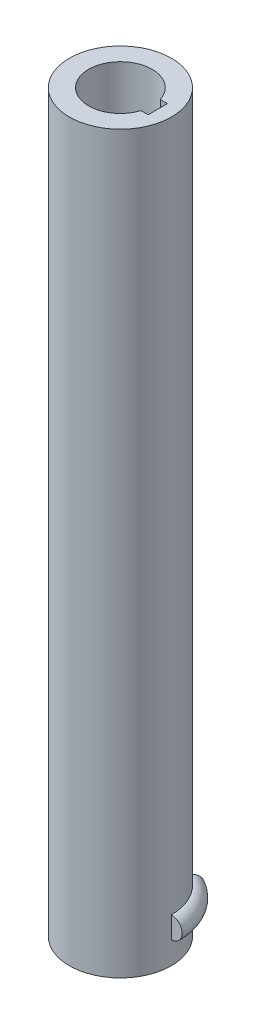
ISO-10303-21;
HEADER;
FILE_DESCRIPTION(('STEP AP214'),'2;1');
FILE_NAME('part.step','',(''),(''),'','','');
FILE_SCHEMA(('AUTOMOTIVE_DESIGN { 1 0 10303 214 1 1 1 1 }'));
ENDSEC;
DATA;
#1=APPLICATION_CONTEXT('core data for automotive mechanical design processes');
#2=APPLICATION_PROTOCOL_DEFINITION('international standard','automotive_design',2000,#1);
#3=PRODUCT_CONTEXT('',#1,'mechanical');
#4=PRODUCT('Part','Part','',(#3));
#5=PRODUCT_RELATED_PRODUCT_CATEGORY('part','',(#4));
#6=PRODUCT_DEFINITION_FORMATION('','',#4);
#7=PRODUCT_DEFINITION_CONTEXT('part definition',#1,'design');
#8=PRODUCT_DEFINITION('design','',#6,#7);
#9=PRODUCT_DEFINITION_SHAPE('','',#8);
#10=(LENGTH_UNIT() NAMED_UNIT(*) SI_UNIT(.MILLI.,.METRE.));
#11=(NAMED_UNIT(*) PLANE_ANGLE_UNIT() SI_UNIT($,.RADIAN.));
#12=(NAMED_UNIT(*) SI_UNIT($,.STERADIAN.) SOLID_ANGLE_UNIT());
#13=UNCERTAINTY_MEASURE_WITH_UNIT(LENGTH_MEASURE(1.E-05),#10,'distance_accuracy_value','');
#14=(GEOMETRIC_REPRESENTATION_CONTEXT(3) GLOBAL_UNCERTAINTY_ASSIGNED_CONTEXT((#13)) GLOBAL_UNIT_ASSIGNED_CONTEXT((#10,
#11,#12)) REPRESENTATION_CONTEXT('',''));
#15=CARTESIAN_POINT('',(0.,0.,0.));
#16=DIRECTION('',(0.,0.,1.));
#17=DIRECTION('',(1.,0.,0.));
#18=AXIS2_PLACEMENT_3D('',#15,#16,#17);
#19=CARTESIAN_POINT('',(-22.5000000000001,619.,-38.9711431702998));
#20=DIRECTION('',(0.,-1.,0.));
#21=DIRECTION('',(0.,0.,-1.));
#22=AXIS2_PLACEMENT_3D('',#19,#20,#21);
#23=PLANE('',#22);
#24=DIRECTION('',(0.,0.,-1.));
#25=VECTOR('',#24,1.);
#26=CARTESIAN_POINT('',(-12.,619.,8.5));
#27=LINE('',#26,#25);
#28=CARTESIAN_POINT('',(-12.,619.,8.5));
#29=VERTEX_POINT('',#28);
#30=CARTESIAN_POINT('',(-12.,619.,-8.5));
#31=VERTEX_POINT('',#30);
#32=EDGE_CURVE('E98',#29,#31,#27,.T.);
#33=ORIENTED_EDGE('',*,*,#32,.F.);
#34=DIRECTION('',(1.,0.,0.));
#35=VECTOR('',#34,1.);
#36=CARTESIAN_POINT('',(-18.3213568560918,619.,8.5));
#37=LINE('',#36,#35);
#38=CARTESIAN_POINT('',(-18.3213568560918,619.,8.5));
#39=VERTEX_POINT('',#38);
#40=EDGE_CURVE('E95',#39,#29,#37,.T.);
#41=ORIENTED_EDGE('',*,*,#40,.F.);
#42=CARTESIAN_POINT('',(-45.,619.,0.));
#43=DIRECTION('',(0.,1.,0.));
#44=DIRECTION('',(0.,0.,1.));
#45=AXIS2_PLACEMENT_3D('',#42,#43,#44);
#46=CIRCLE('',#45,28.);
#47=CARTESIAN_POINT('',(-18.3213568560918,619.,-8.5));
#48=VERTEX_POINT('',#47);
#49=EDGE_CURVE('E109',#48,#39,#46,.T.);
#50=ORIENTED_EDGE('',*,*,#49,.F.);
#51=DIRECTION('',(-1.,0.,0.));
#52=VECTOR('',#51,1.);
#53=CARTESIAN_POINT('',(-18.3213568560918,619.,-8.5));
#54=LINE('',#53,#52);
#55=EDGE_CURVE('E91',#31,#48,#54,.T.);
#56=ORIENTED_EDGE('',*,*,#55,.F.);
#57=EDGE_LOOP('',(#33,#41,#50,#56));
#58=FACE_BOUND('',#57,.T.);
#59=CARTESIAN_POINT('',(-45.,619.,0.));
#60=DIRECTION('',(0.,-1.,0.));
#61=DIRECTION('',(0.,0.,-1.));
#62=AXIS2_PLACEMENT_3D('',#59,#60,#61);
#63=CIRCLE('',#62,45.);
#64=CARTESIAN_POINT('',(-45.,619.,-45.));
#65=VERTEX_POINT('',#64);
#66=EDGE_CURVE('E43',#65,#65,#63,.T.);
#67=ORIENTED_EDGE('',*,*,#66,.F.);
#68=EDGE_LOOP('',(#67));
#69=FACE_BOUND('',#68,.T.);
#70=ADVANCED_FACE('F36',(#58,#69),#23,.F.);
#71=CARTESIAN_POINT('',(-45.,0.,0.));
#72=DIRECTION('',(0.,-1.,0.));
#73=DIRECTION('',(0.,0.,-1.));
#74=AXIS2_PLACEMENT_3D('',#71,#72,#73);
#75=TOROIDAL_SURFACE('',#74,45.,9.5);
#76=CARTESIAN_POINT('',(-45.,-9.5,0.));
#77=DIRECTION('',(0.,-1.,0.));
#78=DIRECTION('',(0.,0.,-1.));
#79=AXIS2_PLACEMENT_3D('',#76,#77,#78);
#80=CIRCLE('',#79,45.);
#81=CARTESIAN_POINT('',(-22.5000000000001,-9.5,-38.9711431702998));
#82=VERTEX_POINT('',#81);
#83=CARTESIAN_POINT('',(0.,-9.50000000000001,0.));
#84=VERTEX_POINT('',#83);
#85=EDGE_CURVE('E133',#82,#84,#80,.T.);
#86=ORIENTED_EDGE('',*,*,#85,.F.);
#87=CARTESIAN_POINT('',(-22.5000000000001,0.,-38.9711431702998));
#88=DIRECTION('',(-0.86602540378444,0.,-0.499999999999998));
#89=DIRECTION('',(0.499999999999998,0.,-0.86602540378444));
#90=AXIS2_PLACEMENT_3D('',#87,#88,#89);
#91=CIRCLE('',#90,9.5);
#92=CARTESIAN_POINT('',(-22.5000000000001,9.50000000000001,-38.9711431702998));
#93=VERTEX_POINT('',#92);
#94=EDGE_CURVE('E128',#93,#82,#91,.T.);
#95=ORIENTED_EDGE('',*,*,#94,.F.);
#96=CARTESIAN_POINT('',(-45.,9.5,0.));
#97=DIRECTION('',(0.,-1.,0.));
#98=DIRECTION('',(0.,0.,-1.));
#99=AXIS2_PLACEMENT_3D('',#96,#97,#98);
#100=CIRCLE('',#99,45.);
#101=CARTESIAN_POINT('',(0.,9.5,0.));
#102=VERTEX_POINT('',#101);
#103=EDGE_CURVE('E136',#93,#102,#100,.T.);
#104=ORIENTED_EDGE('',*,*,#103,.T.);
#105=CARTESIAN_POINT('',(0.,0.,0.));
#106=DIRECTION('',(0.,0.,-1.));
#107=DIRECTION('',(1.,0.,0.));
#108=AXIS2_PLACEMENT_3D('',#105,#106,#107);
#109=CIRCLE('',#108,9.5);
#110=EDGE_CURVE('E125',#102,#84,#109,.T.);
#111=ORIENTED_EDGE('',*,*,#110,.T.);
#112=EDGE_LOOP('',(#86,#95,#104,#111));
#113=FACE_BOUND('',#112,.T.);
#114=ADVANCED_FACE('F143',(#113),#75,.T.);
#115=CARTESIAN_POINT('',(-45.,0.0940904230531808,0.));
#116=DIRECTION('',(0.,-1.,0.));
#117=DIRECTION('',(0.,0.,-1.));
#118=AXIS2_PLACEMENT_3D('',#115,#116,#117);
#119=CYLINDRICAL_SURFACE('',#118,45.);
#120=ORIENTED_EDGE('',*,*,#103,.F.);
#121=DIRECTION('',(0.,1.,0.));
#122=VECTOR('',#121,1.);
#123=CARTESIAN_POINT('',(-22.5000000000001,-156.779220613582,-38.9711431702998));
#124=LINE('',#123,#122);
#125=EDGE_CURVE('E57',#93,#82,#124,.F.);
#126=ORIENTED_EDGE('',*,*,#125,.T.);
#127=ORIENTED_EDGE('',*,*,#85,.T.);
#128=DIRECTION('',(0.,1.,0.));
#129=VECTOR('',#128,1.);
#130=CARTESIAN_POINT('',(0.,-156.779220613582,0.));
#131=LINE('',#130,#129);
#132=EDGE_CURVE('E11',#102,#84,#131,.F.);
#133=ORIENTED_EDGE('',*,*,#132,.F.);
#134=EDGE_LOOP('',(#120,#126,#127,#133));
#135=FACE_BOUND('',#134,.T.);
#136=CARTESIAN_POINT('',(-45.,-29.5,0.));
#137=DIRECTION('',(0.,-1.,0.));
#138=DIRECTION('',(0.,0.,-1.));
#139=AXIS2_PLACEMENT_3D('',#136,#137,#138);
#140=CIRCLE('',#139,45.);
#141=CARTESIAN_POINT('',(-45.,-29.5,-45.));
#142=VERTEX_POINT('',#141);
#143=EDGE_CURVE('E130',#142,#142,#140,.T.);
#144=ORIENTED_EDGE('',*,*,#143,.F.);
#145=EDGE_LOOP('',(#144));
#146=FACE_BOUND('',#145,.T.);
#147=ORIENTED_EDGE('',*,*,#66,.T.);
#148=EDGE_LOOP('',(#147));
#149=FACE_BOUND('',#148,.T.);
#150=ADVANCED_FACE('F141',(#135,#146,#149),#119,.T.);
#151=CARTESIAN_POINT('',(-22.5000000000001,-29.5000000000032,-38.9711431702998));
#152=DIRECTION('',(0.,1.,0.));
#153=DIRECTION('',(0.,0.,1.));
#154=AXIS2_PLACEMENT_3D('',#151,#152,#153);
#155=PLANE('',#154);
#156=ORIENTED_EDGE('',*,*,#143,.T.);
#157=EDGE_LOOP('',(#156));
#158=FACE_BOUND('',#157,.T.);
#159=ADVANCED_FACE('F151',(#158),#155,.F.);
#160=CARTESIAN_POINT('',(-22.5000000000001,0.,-38.9711431702998));
#161=DIRECTION('',(-0.86602540378444,0.,-0.499999999999998));
#162=DIRECTION('',(-0.499999999999998,0.,0.86602540378444));
#163=AXIS2_PLACEMENT_3D('',#160,#161,#162);
#164=PLANE('',#163);
#165=ORIENTED_EDGE('',*,*,#125,.F.);
#166=ORIENTED_EDGE('',*,*,#94,.T.);
#167=EDGE_LOOP('',(#165,#166));
#168=FACE_BOUND('',#167,.T.);
#169=ADVANCED_FACE('F158',(#168),#164,.T.);
#170=CARTESIAN_POINT('',(0.,0.,0.));
#171=DIRECTION('',(0.,0.,-1.));
#172=DIRECTION('',(-1.,0.,0.));
#173=AXIS2_PLACEMENT_3D('',#170,#171,#172);
#174=PLANE('',#173);
#175=ORIENTED_EDGE('',*,*,#110,.F.);
#176=ORIENTED_EDGE('',*,*,#132,.T.);
#177=EDGE_LOOP('',(#175,#176));
#178=FACE_BOUND('',#177,.T.);
#179=ADVANCED_FACE('F162',(#178),#174,.F.);
#180=CARTESIAN_POINT('',(-45.,579.,0.));
#181=DIRECTION('',(0.,1.,0.));
#182=DIRECTION('',(0.,0.,1.));
#183=AXIS2_PLACEMENT_3D('',#180,#181,#182);
#184=CYLINDRICAL_SURFACE('',#183,28.);
#185=ORIENTED_EDGE('',*,*,#49,.T.);
#186=DIRECTION('',(0.,1.,0.));
#187=VECTOR('',#186,1.);
#188=CARTESIAN_POINT('',(-18.3213568560918,560.862757858427,8.5));
#189=LINE('',#188,#187);
#190=CARTESIAN_POINT('',(-18.3213568560918,579.,8.5));
#191=VERTEX_POINT('',#190);
#192=EDGE_CURVE('E116',#191,#39,#189,.T.);
#193=ORIENTED_EDGE('',*,*,#192,.F.);
#194=CARTESIAN_POINT('',(-45.,579.,0.));
#195=DIRECTION('',(0.,1.,0.));
#196=DIRECTION('',(0.,0.,1.));
#197=AXIS2_PLACEMENT_3D('',#194,#195,#196);
#198=CIRCLE('',#197,28.);
#199=CARTESIAN_POINT('',(-18.3213568560918,579.,-8.5));
#200=VERTEX_POINT('',#199);
#201=EDGE_CURVE('E121',#200,#191,#198,.T.);
#202=ORIENTED_EDGE('',*,*,#201,.F.);
#203=DIRECTION('',(0.,1.,0.));
#204=VECTOR('',#203,1.);
#205=CARTESIAN_POINT('',(-18.3213568560918,560.862757858427,-8.5));
#206=LINE('',#205,#204);
#207=EDGE_CURVE('E94',#200,#48,#206,.T.);
#208=ORIENTED_EDGE('',*,*,#207,.T.);
#209=EDGE_LOOP('',(#185,#193,#202,#208));
#210=FACE_BOUND('',#209,.T.);
#211=ADVANCED_FACE('F165',(#210),#184,.F.);
#212=CARTESIAN_POINT('',(-45.,579.,0.));
#213=DIRECTION('',(0.,1.,0.));
#214=DIRECTION('',(0.,0.,1.));
#215=AXIS2_PLACEMENT_3D('',#212,#213,#214);
#216=PLANE('',#215);
#217=ORIENTED_EDGE('',*,*,#201,.T.);
#218=DIRECTION('',(-1.,0.,0.));
#219=VECTOR('',#218,1.);
#220=CARTESIAN_POINT('',(-18.3213568560918,579.,8.5));
#221=LINE('',#220,#219);
#222=CARTESIAN_POINT('',(-12.,579.,8.5));
#223=VERTEX_POINT('',#222);
#224=EDGE_CURVE('E115',#223,#191,#221,.T.);
#225=ORIENTED_EDGE('',*,*,#224,.F.);
#226=DIRECTION('',(0.,0.,1.));
#227=VECTOR('',#226,1.);
#228=CARTESIAN_POINT('',(-12.,579.,8.5));
#229=LINE('',#228,#227);
#230=CARTESIAN_POINT('',(-12.,579.,-8.5));
#231=VERTEX_POINT('',#230);
#232=EDGE_CURVE('E120',#231,#223,#229,.T.);
#233=ORIENTED_EDGE('',*,*,#232,.F.);
#234=DIRECTION('',(1.,0.,0.));
#235=VECTOR('',#234,1.);
#236=CARTESIAN_POINT('',(-18.3213568560918,579.,-8.5));
#237=LINE('',#236,#235);
#238=EDGE_CURVE('E50',#200,#231,#237,.T.);
#239=ORIENTED_EDGE('',*,*,#238,.F.);
#240=EDGE_LOOP('',(#217,#225,#233,#239));
#241=FACE_BOUND('',#240,.T.);
#242=ADVANCED_FACE('F169',(#241),#216,.T.);
#243=CARTESIAN_POINT('',(-12.,560.862757858427,8.5));
#244=DIRECTION('',(1.,0.,0.));
#245=DIRECTION('',(0.,0.,-1.));
#246=AXIS2_PLACEMENT_3D('',#243,#244,#245);
#247=PLANE('',#246);
#248=ORIENTED_EDGE('',*,*,#232,.T.);
#249=DIRECTION('',(0.,1.,0.));
#250=VECTOR('',#249,1.);
#251=CARTESIAN_POINT('',(-12.,560.862757858427,8.5));
#252=LINE('',#251,#250);
#253=EDGE_CURVE('E101',#223,#29,#252,.T.);
#254=ORIENTED_EDGE('',*,*,#253,.T.);
#255=ORIENTED_EDGE('',*,*,#32,.T.);
#256=DIRECTION('',(0.,1.,0.));
#257=VECTOR('',#256,1.);
#258=CARTESIAN_POINT('',(-12.,560.862757858427,-8.5));
#259=LINE('',#258,#257);
#260=EDGE_CURVE('E87',#231,#31,#259,.T.);
#261=ORIENTED_EDGE('',*,*,#260,.F.);
#262=EDGE_LOOP('',(#248,#254,#255,#261));
#263=FACE_BOUND('',#262,.T.);
#264=ADVANCED_FACE('F99',(#263),#247,.F.);
#265=CARTESIAN_POINT('',(-18.3213568560918,560.862757858427,8.5));
#266=DIRECTION('',(0.,0.,1.));
#267=DIRECTION('',(1.,0.,0.));
#268=AXIS2_PLACEMENT_3D('',#265,#266,#267);
#269=PLANE('',#268);
#270=ORIENTED_EDGE('',*,*,#224,.T.);
#271=ORIENTED_EDGE('',*,*,#192,.T.);
#272=ORIENTED_EDGE('',*,*,#40,.T.);
#273=ORIENTED_EDGE('',*,*,#253,.F.);
#274=EDGE_LOOP('',(#270,#271,#272,#273));
#275=FACE_BOUND('',#274,.T.);
#276=ADVANCED_FACE('F175',(#275),#269,.F.);
#277=CARTESIAN_POINT('',(-18.3213568560918,560.862757858427,-8.5));
#278=DIRECTION('',(0.,0.,-1.));
#279=DIRECTION('',(-1.,0.,0.));
#280=AXIS2_PLACEMENT_3D('',#277,#278,#279);
#281=PLANE('',#280);
#282=ORIENTED_EDGE('',*,*,#238,.T.);
#283=ORIENTED_EDGE('',*,*,#260,.T.);
#284=ORIENTED_EDGE('',*,*,#55,.T.);
#285=ORIENTED_EDGE('',*,*,#207,.F.);
#286=EDGE_LOOP('',(#282,#283,#284,#285));
#287=FACE_BOUND('',#286,.T.);
#288=ADVANCED_FACE('F89',(#287),#281,.F.);
#289=CLOSED_SHELL('',(#70,#114,#150,#159,#169,#179,#211,#242,#264,#276,#288));
#290=MANIFOLD_SOLID_BREP('B2',#289);
#291=ADVANCED_BREP_SHAPE_REPRESENTATION('',(#18,#290),#14);
#292=SHAPE_DEFINITION_REPRESENTATION(#9,#291);
ENDSEC;
END-ISO-10303-21;
